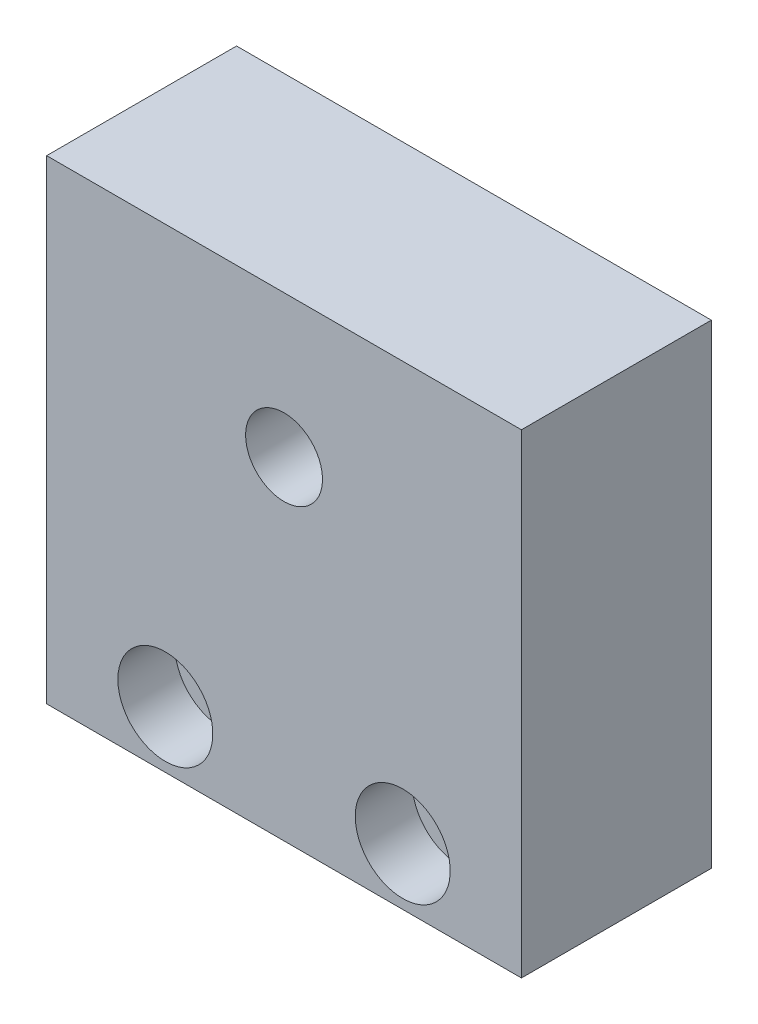
ISO-10303-21;
HEADER;
FILE_DESCRIPTION(('STEP AP214'),'2;1');
FILE_NAME('part.step','',(''),(''),'','','');
FILE_SCHEMA(('AUTOMOTIVE_DESIGN { 1 0 10303 214 1 1 1 1 }'));
ENDSEC;
DATA;
#1=APPLICATION_CONTEXT('core data for automotive mechanical design processes');
#2=APPLICATION_PROTOCOL_DEFINITION('international standard','automotive_design',2000,#1);
#3=PRODUCT_CONTEXT('',#1,'mechanical');
#4=PRODUCT('Part','Part','',(#3));
#5=PRODUCT_RELATED_PRODUCT_CATEGORY('part','',(#4));
#6=PRODUCT_DEFINITION_FORMATION('','',#4);
#7=PRODUCT_DEFINITION_CONTEXT('part definition',#1,'design');
#8=PRODUCT_DEFINITION('design','',#6,#7);
#9=PRODUCT_DEFINITION_SHAPE('','',#8);
#10=(LENGTH_UNIT() NAMED_UNIT(*) SI_UNIT(.MILLI.,.METRE.));
#11=(NAMED_UNIT(*) PLANE_ANGLE_UNIT() SI_UNIT($,.RADIAN.));
#12=(NAMED_UNIT(*) SI_UNIT($,.STERADIAN.) SOLID_ANGLE_UNIT());
#13=UNCERTAINTY_MEASURE_WITH_UNIT(LENGTH_MEASURE(1.E-05),#10,'distance_accuracy_value','');
#14=(GEOMETRIC_REPRESENTATION_CONTEXT(3) GLOBAL_UNCERTAINTY_ASSIGNED_CONTEXT((#13)) GLOBAL_UNIT_ASSIGNED_CONTEXT((#10,
#11,#12)) REPRESENTATION_CONTEXT('',''));
#15=CARTESIAN_POINT('',(0.,0.,0.));
#16=DIRECTION('',(0.,0.,1.));
#17=DIRECTION('',(1.,0.,0.));
#18=AXIS2_PLACEMENT_3D('',#15,#16,#17);
#19=CARTESIAN_POINT('',(0.,0.,20.));
#20=DIRECTION('',(0.,0.,1.));
#21=DIRECTION('',(1.,0.,0.));
#22=AXIS2_PLACEMENT_3D('',#19,#20,#21);
#23=PLANE('',#22);
#24=CARTESIAN_POINT('',(12.5,-19.,20.));
#25=DIRECTION('',(0.,0.,-1.));
#26=DIRECTION('',(1.,0.,0.));
#27=AXIS2_PLACEMENT_3D('',#24,#25,#26);
#28=CIRCLE('',#27,5.);
#29=CARTESIAN_POINT('',(7.5,-19.,20.));
#30=VERTEX_POINT('',#29);
#31=EDGE_CURVE('E185',#30,#30,#28,.T.);
#32=ORIENTED_EDGE('',*,*,#31,.T.);
#33=EDGE_LOOP('',(#32));
#34=FACE_BOUND('',#33,.T.);
#35=CARTESIAN_POINT('',(-12.5,-19.,20.));
#36=DIRECTION('',(0.,0.,-1.));
#37=DIRECTION('',(1.,0.,0.));
#38=AXIS2_PLACEMENT_3D('',#35,#36,#37);
#39=CIRCLE('',#38,5.);
#40=CARTESIAN_POINT('',(-17.5,-19.,20.));
#41=VERTEX_POINT('',#40);
#42=EDGE_CURVE('E155',#41,#41,#39,.T.);
#43=ORIENTED_EDGE('',*,*,#42,.T.);
#44=EDGE_LOOP('',(#43));
#45=FACE_BOUND('',#44,.T.);
#46=CARTESIAN_POINT('',(0.,10.,20.));
#47=DIRECTION('',(0.,0.,-1.));
#48=DIRECTION('',(1.,0.,0.));
#49=AXIS2_PLACEMENT_3D('',#46,#47,#48);
#50=CIRCLE('',#49,4.05);
#51=CARTESIAN_POINT('',(-4.05,10.,20.));
#52=VERTEX_POINT('',#51);
#53=EDGE_CURVE('E154',#52,#52,#50,.T.);
#54=ORIENTED_EDGE('',*,*,#53,.T.);
#55=EDGE_LOOP('',(#54));
#56=FACE_BOUND('',#55,.T.);
#57=DIRECTION('',(-1.,0.,0.));
#58=VECTOR('',#57,1.);
#59=CARTESIAN_POINT('',(-25.,25.,20.));
#60=LINE('',#59,#58);
#61=CARTESIAN_POINT('',(25.,25.,20.));
#62=VERTEX_POINT('',#61);
#63=CARTESIAN_POINT('',(-25.,25.,20.));
#64=VERTEX_POINT('',#63);
#65=EDGE_CURVE('E11',#62,#64,#60,.T.);
#66=ORIENTED_EDGE('',*,*,#65,.T.);
#67=DIRECTION('',(0.,-1.,0.));
#68=VECTOR('',#67,1.);
#69=CARTESIAN_POINT('',(-25.,-25.,20.));
#70=LINE('',#69,#68);
#71=CARTESIAN_POINT('',(-25.,-25.,20.));
#72=VERTEX_POINT('',#71);
#73=EDGE_CURVE('E21',#64,#72,#70,.T.);
#74=ORIENTED_EDGE('',*,*,#73,.T.);
#75=DIRECTION('',(1.,0.,0.));
#76=VECTOR('',#75,1.);
#77=CARTESIAN_POINT('',(25.,-25.,20.));
#78=LINE('',#77,#76);
#79=CARTESIAN_POINT('',(25.,-25.,20.));
#80=VERTEX_POINT('',#79);
#81=EDGE_CURVE('E122',#72,#80,#78,.T.);
#82=ORIENTED_EDGE('',*,*,#81,.T.);
#83=DIRECTION('',(0.,1.,0.));
#84=VECTOR('',#83,1.);
#85=CARTESIAN_POINT('',(25.,25.,20.));
#86=LINE('',#85,#84);
#87=EDGE_CURVE('E193',#80,#62,#86,.T.);
#88=ORIENTED_EDGE('',*,*,#87,.T.);
#89=EDGE_LOOP('',(#66,#74,#82,#88));
#90=FACE_BOUND('',#89,.T.);
#91=ADVANCED_FACE('F17',(#34,#45,#56,#90),#23,.T.);
#92=CARTESIAN_POINT('',(0.,0.,0.));
#93=DIRECTION('',(0.,0.,1.));
#94=DIRECTION('',(1.,0.,0.));
#95=AXIS2_PLACEMENT_3D('',#92,#93,#94);
#96=PLANE('',#95);
#97=CARTESIAN_POINT('',(12.5,-19.,0.));
#98=DIRECTION('',(0.,0.,1.));
#99=DIRECTION('',(1.,0.,0.));
#100=AXIS2_PLACEMENT_3D('',#97,#98,#99);
#101=CIRCLE('',#100,3.05);
#102=CARTESIAN_POINT('',(9.45,-19.,0.));
#103=VERTEX_POINT('',#102);
#104=EDGE_CURVE('E103',#103,#103,#101,.T.);
#105=ORIENTED_EDGE('',*,*,#104,.T.);
#106=EDGE_LOOP('',(#105));
#107=FACE_BOUND('',#106,.T.);
#108=CARTESIAN_POINT('',(-12.5,-19.,0.));
#109=DIRECTION('',(0.,0.,1.));
#110=DIRECTION('',(1.,0.,0.));
#111=AXIS2_PLACEMENT_3D('',#108,#109,#110);
#112=CIRCLE('',#111,3.05);
#113=CARTESIAN_POINT('',(-15.55,-19.,0.));
#114=VERTEX_POINT('',#113);
#115=EDGE_CURVE('E166',#114,#114,#112,.T.);
#116=ORIENTED_EDGE('',*,*,#115,.T.);
#117=EDGE_LOOP('',(#116));
#118=FACE_BOUND('',#117,.T.);
#119=CARTESIAN_POINT('',(0.,10.,0.));
#120=DIRECTION('',(0.,0.,1.));
#121=DIRECTION('',(1.,0.,0.));
#122=AXIS2_PLACEMENT_3D('',#119,#120,#121);
#123=CIRCLE('',#122,4.05);
#124=CARTESIAN_POINT('',(-4.05,10.,0.));
#125=VERTEX_POINT('',#124);
#126=EDGE_CURVE('E153',#125,#125,#123,.T.);
#127=ORIENTED_EDGE('',*,*,#126,.T.);
#128=EDGE_LOOP('',(#127));
#129=FACE_BOUND('',#128,.T.);
#130=DIRECTION('',(1.,0.,0.));
#131=VECTOR('',#130,1.);
#132=CARTESIAN_POINT('',(-25.,25.,0.));
#133=LINE('',#132,#131);
#134=CARTESIAN_POINT('',(-25.,25.,0.));
#135=VERTEX_POINT('',#134);
#136=CARTESIAN_POINT('',(25.,25.,0.));
#137=VERTEX_POINT('',#136);
#138=EDGE_CURVE('E28',#135,#137,#133,.T.);
#139=ORIENTED_EDGE('',*,*,#138,.T.);
#140=DIRECTION('',(0.,-1.,0.));
#141=VECTOR('',#140,1.);
#142=CARTESIAN_POINT('',(25.,25.,0.));
#143=LINE('',#142,#141);
#144=CARTESIAN_POINT('',(25.,-25.,0.));
#145=VERTEX_POINT('',#144);
#146=EDGE_CURVE('E175',#137,#145,#143,.T.);
#147=ORIENTED_EDGE('',*,*,#146,.T.);
#148=DIRECTION('',(-1.,0.,0.));
#149=VECTOR('',#148,1.);
#150=CARTESIAN_POINT('',(25.,-25.,0.));
#151=LINE('',#150,#149);
#152=CARTESIAN_POINT('',(-25.,-25.,0.));
#153=VERTEX_POINT('',#152);
#154=EDGE_CURVE('E141',#145,#153,#151,.T.);
#155=ORIENTED_EDGE('',*,*,#154,.T.);
#156=DIRECTION('',(0.,1.,0.));
#157=VECTOR('',#156,1.);
#158=CARTESIAN_POINT('',(-25.,-25.,0.));
#159=LINE('',#158,#157);
#160=EDGE_CURVE('E128',#153,#135,#159,.T.);
#161=ORIENTED_EDGE('',*,*,#160,.T.);
#162=EDGE_LOOP('',(#139,#147,#155,#161));
#163=FACE_BOUND('',#162,.T.);
#164=ADVANCED_FACE('F239',(#107,#118,#129,#163),#96,.F.);
#165=CARTESIAN_POINT('',(25.,25.,0.));
#166=DIRECTION('',(0.,1.,0.));
#167=DIRECTION('',(1.,0.,0.));
#168=AXIS2_PLACEMENT_3D('',#165,#166,#167);
#169=PLANE('',#168);
#170=ORIENTED_EDGE('',*,*,#138,.F.);
#171=DIRECTION('',(0.,0.,1.));
#172=VECTOR('',#171,1.);
#173=CARTESIAN_POINT('',(-25.,25.,0.));
#174=LINE('',#173,#172);
#175=EDGE_CURVE('E127',#135,#64,#174,.T.);
#176=ORIENTED_EDGE('',*,*,#175,.T.);
#177=ORIENTED_EDGE('',*,*,#65,.F.);
#178=DIRECTION('',(0.,0.,1.));
#179=VECTOR('',#178,1.);
#180=CARTESIAN_POINT('',(25.,25.,0.));
#181=LINE('',#180,#179);
#182=EDGE_CURVE('E178',#137,#62,#181,.T.);
#183=ORIENTED_EDGE('',*,*,#182,.F.);
#184=EDGE_LOOP('',(#170,#176,#177,#183));
#185=FACE_BOUND('',#184,.T.);
#186=ADVANCED_FACE('F245',(#185),#169,.T.);
#187=CARTESIAN_POINT('',(-25.,25.,0.));
#188=DIRECTION('',(-1.,0.,0.));
#189=DIRECTION('',(0.,0.,1.));
#190=AXIS2_PLACEMENT_3D('',#187,#188,#189);
#191=PLANE('',#190);
#192=ORIENTED_EDGE('',*,*,#160,.F.);
#193=DIRECTION('',(0.,0.,1.));
#194=VECTOR('',#193,1.);
#195=CARTESIAN_POINT('',(-25.,-25.,0.));
#196=LINE('',#195,#194);
#197=EDGE_CURVE('E130',#153,#72,#196,.T.);
#198=ORIENTED_EDGE('',*,*,#197,.T.);
#199=ORIENTED_EDGE('',*,*,#73,.F.);
#200=ORIENTED_EDGE('',*,*,#175,.F.);
#201=EDGE_LOOP('',(#192,#198,#199,#200));
#202=FACE_BOUND('',#201,.T.);
#203=ADVANCED_FACE('F131',(#202),#191,.T.);
#204=CARTESIAN_POINT('',(-25.,-25.,0.));
#205=DIRECTION('',(0.,-1.,0.));
#206=DIRECTION('',(0.,0.,-1.));
#207=AXIS2_PLACEMENT_3D('',#204,#205,#206);
#208=PLANE('',#207);
#209=ORIENTED_EDGE('',*,*,#154,.F.);
#210=DIRECTION('',(0.,0.,1.));
#211=VECTOR('',#210,1.);
#212=CARTESIAN_POINT('',(25.,-25.,0.));
#213=LINE('',#212,#211);
#214=EDGE_CURVE('E138',#145,#80,#213,.T.);
#215=ORIENTED_EDGE('',*,*,#214,.T.);
#216=ORIENTED_EDGE('',*,*,#81,.F.);
#217=ORIENTED_EDGE('',*,*,#197,.F.);
#218=EDGE_LOOP('',(#209,#215,#216,#217));
#219=FACE_BOUND('',#218,.T.);
#220=ADVANCED_FACE('F136',(#219),#208,.T.);
#221=CARTESIAN_POINT('',(25.,-25.,0.));
#222=DIRECTION('',(1.,0.,0.));
#223=DIRECTION('',(0.,1.,0.));
#224=AXIS2_PLACEMENT_3D('',#221,#222,#223);
#225=PLANE('',#224);
#226=ORIENTED_EDGE('',*,*,#146,.F.);
#227=ORIENTED_EDGE('',*,*,#182,.T.);
#228=ORIENTED_EDGE('',*,*,#87,.F.);
#229=ORIENTED_EDGE('',*,*,#214,.F.);
#230=EDGE_LOOP('',(#226,#227,#228,#229));
#231=FACE_BOUND('',#230,.T.);
#232=ADVANCED_FACE('F249',(#231),#225,.T.);
#233=CARTESIAN_POINT('',(12.5,-19.,-53.4846922834954));
#234=DIRECTION('',(0.,0.,1.));
#235=DIRECTION('',(1.,0.,0.));
#236=AXIS2_PLACEMENT_3D('',#233,#234,#235);
#237=CYLINDRICAL_SURFACE('',#236,3.05);
#238=CARTESIAN_POINT('',(12.5,-19.,14.));
#239=DIRECTION('',(0.,0.,1.));
#240=DIRECTION('',(1.,0.,0.));
#241=AXIS2_PLACEMENT_3D('',#238,#239,#240);
#242=CIRCLE('',#241,3.05);
#243=CARTESIAN_POINT('',(9.45,-19.,14.));
#244=VERTEX_POINT('',#243);
#245=EDGE_CURVE('E165',#244,#244,#242,.T.);
#246=ORIENTED_EDGE('',*,*,#245,.T.);
#247=DIRECTION('',(0.,0.,-1.));
#248=VECTOR('',#247,1.);
#249=CARTESIAN_POINT('',(9.45,-19.,-53.4846922834954));
#250=LINE('',#249,#248);
#251=EDGE_CURVE('E167',#244,#103,#250,.T.);
#252=ORIENTED_EDGE('',*,*,#251,.T.);
#253=ORIENTED_EDGE('',*,*,#104,.F.);
#254=ORIENTED_EDGE('',*,*,#251,.F.);
#255=EDGE_LOOP('',(#246,#252,#253,#254));
#256=FACE_BOUND('',#255,.T.);
#257=ADVANCED_FACE('F19',(#256),#237,.F.);
#258=CARTESIAN_POINT('',(12.5,-19.,17.));
#259=DIRECTION('',(0.,0.,1.));
#260=DIRECTION('',(1.,0.,0.));
#261=AXIS2_PLACEMENT_3D('',#258,#259,#260);
#262=CYLINDRICAL_SURFACE('',#261,5.);
#263=ORIENTED_EDGE('',*,*,#31,.F.);
#264=DIRECTION('',(0.,0.,-1.));
#265=VECTOR('',#264,1.);
#266=CARTESIAN_POINT('',(7.5,-19.,17.));
#267=LINE('',#266,#265);
#268=CARTESIAN_POINT('',(7.5,-19.,14.));
#269=VERTEX_POINT('',#268);
#270=EDGE_CURVE('E112',#30,#269,#267,.T.);
#271=ORIENTED_EDGE('',*,*,#270,.T.);
#272=CARTESIAN_POINT('',(12.5,-19.,14.));
#273=DIRECTION('',(0.,0.,1.));
#274=DIRECTION('',(1.,0.,0.));
#275=AXIS2_PLACEMENT_3D('',#272,#273,#274);
#276=CIRCLE('',#275,5.);
#277=EDGE_CURVE('E161',#269,#269,#276,.T.);
#278=ORIENTED_EDGE('',*,*,#277,.F.);
#279=ORIENTED_EDGE('',*,*,#270,.F.);
#280=EDGE_LOOP('',(#263,#271,#278,#279));
#281=FACE_BOUND('',#280,.T.);
#282=ADVANCED_FACE('F219',(#281),#262,.F.);
#283=CARTESIAN_POINT('',(12.5,-19.,14.));
#284=DIRECTION('',(0.,0.,1.));
#285=DIRECTION('',(1.,0.,0.));
#286=AXIS2_PLACEMENT_3D('',#283,#284,#285);
#287=PLANE('',#286);
#288=ORIENTED_EDGE('',*,*,#245,.F.);
#289=EDGE_LOOP('',(#288));
#290=FACE_BOUND('',#289,.T.);
#291=ORIENTED_EDGE('',*,*,#277,.T.);
#292=EDGE_LOOP('',(#291));
#293=FACE_BOUND('',#292,.T.);
#294=ADVANCED_FACE('F221',(#290,#293),#287,.T.);
#295=CARTESIAN_POINT('',(-12.5,-19.,-53.4846922834954));
#296=DIRECTION('',(0.,0.,1.));
#297=DIRECTION('',(1.,0.,0.));
#298=AXIS2_PLACEMENT_3D('',#295,#296,#297);
#299=CYLINDRICAL_SURFACE('',#298,3.05);
#300=CARTESIAN_POINT('',(-12.5,-19.,14.));
#301=DIRECTION('',(0.,0.,1.));
#302=DIRECTION('',(1.,0.,0.));
#303=AXIS2_PLACEMENT_3D('',#300,#301,#302);
#304=CIRCLE('',#303,3.05);
#305=CARTESIAN_POINT('',(-15.55,-19.,14.));
#306=VERTEX_POINT('',#305);
#307=EDGE_CURVE('E160',#306,#306,#304,.T.);
#308=ORIENTED_EDGE('',*,*,#307,.T.);
#309=DIRECTION('',(0.,0.,-1.));
#310=VECTOR('',#309,1.);
#311=CARTESIAN_POINT('',(-15.55,-19.,-53.4846922834954));
#312=LINE('',#311,#310);
#313=EDGE_CURVE('E171',#306,#114,#312,.T.);
#314=ORIENTED_EDGE('',*,*,#313,.T.);
#315=ORIENTED_EDGE('',*,*,#115,.F.);
#316=ORIENTED_EDGE('',*,*,#313,.F.);
#317=EDGE_LOOP('',(#308,#314,#315,#316));
#318=FACE_BOUND('',#317,.T.);
#319=ADVANCED_FACE('F223',(#318),#299,.F.);
#320=CARTESIAN_POINT('',(-12.5,-19.,17.));
#321=DIRECTION('',(0.,0.,1.));
#322=DIRECTION('',(1.,0.,0.));
#323=AXIS2_PLACEMENT_3D('',#320,#321,#322);
#324=CYLINDRICAL_SURFACE('',#323,5.);
#325=ORIENTED_EDGE('',*,*,#42,.F.);
#326=DIRECTION('',(0.,0.,-1.));
#327=VECTOR('',#326,1.);
#328=CARTESIAN_POINT('',(-17.5,-19.,17.));
#329=LINE('',#328,#327);
#330=CARTESIAN_POINT('',(-17.5,-19.,14.));
#331=VERTEX_POINT('',#330);
#332=EDGE_CURVE('E159',#41,#331,#329,.T.);
#333=ORIENTED_EDGE('',*,*,#332,.T.);
#334=CARTESIAN_POINT('',(-12.5,-19.,14.));
#335=DIRECTION('',(0.,0.,1.));
#336=DIRECTION('',(1.,0.,0.));
#337=AXIS2_PLACEMENT_3D('',#334,#335,#336);
#338=CIRCLE('',#337,5.);
#339=EDGE_CURVE('E203',#331,#331,#338,.T.);
#340=ORIENTED_EDGE('',*,*,#339,.F.);
#341=ORIENTED_EDGE('',*,*,#332,.F.);
#342=EDGE_LOOP('',(#325,#333,#340,#341));
#343=FACE_BOUND('',#342,.T.);
#344=ADVANCED_FACE('F231',(#343),#324,.F.);
#345=CARTESIAN_POINT('',(-12.5,-19.,14.));
#346=DIRECTION('',(0.,0.,1.));
#347=DIRECTION('',(1.,0.,0.));
#348=AXIS2_PLACEMENT_3D('',#345,#346,#347);
#349=PLANE('',#348);
#350=ORIENTED_EDGE('',*,*,#307,.F.);
#351=EDGE_LOOP('',(#350));
#352=FACE_BOUND('',#351,.T.);
#353=ORIENTED_EDGE('',*,*,#339,.T.);
#354=EDGE_LOOP('',(#353));
#355=FACE_BOUND('',#354,.T.);
#356=ADVANCED_FACE('F254',(#352,#355),#349,.T.);
#357=CARTESIAN_POINT('',(0.,10.,-53.4846922834954));
#358=DIRECTION('',(0.,0.,1.));
#359=DIRECTION('',(1.,0.,0.));
#360=AXIS2_PLACEMENT_3D('',#357,#358,#359);
#361=CYLINDRICAL_SURFACE('',#360,4.05);
#362=ORIENTED_EDGE('',*,*,#53,.F.);
#363=DIRECTION('',(0.,0.,-1.));
#364=VECTOR('',#363,1.);
#365=CARTESIAN_POINT('',(-4.05,10.,-53.4846922834954));
#366=LINE('',#365,#364);
#367=EDGE_CURVE('E149',#52,#125,#366,.T.);
#368=ORIENTED_EDGE('',*,*,#367,.T.);
#369=ORIENTED_EDGE('',*,*,#126,.F.);
#370=ORIENTED_EDGE('',*,*,#367,.F.);
#371=EDGE_LOOP('',(#362,#368,#369,#370));
#372=FACE_BOUND('',#371,.T.);
#373=ADVANCED_FACE('F258',(#372),#361,.F.);
#374=CLOSED_SHELL('',(#91,#164,#186,#203,#220,#232,#257,#282,#294,#319,#344,#356,#373));
#375=MANIFOLD_SOLID_BREP('B1',#374);
#376=ADVANCED_BREP_SHAPE_REPRESENTATION('',(#18,#375),#14);
#377=SHAPE_DEFINITION_REPRESENTATION(#9,#376);
ENDSEC;
END-ISO-10303-21;
